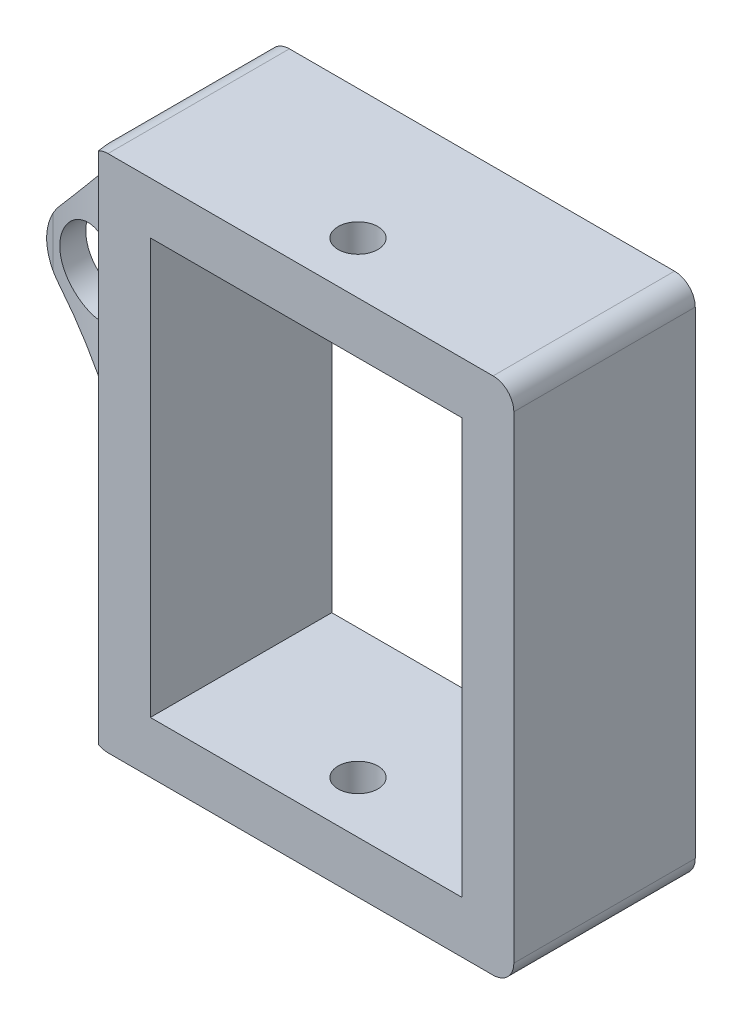
ISO-10303-21;
HEADER;
FILE_DESCRIPTION(('STEP AP214'),'2;1');
FILE_NAME('part.step','',(''),(''),'','','');
FILE_SCHEMA(('AUTOMOTIVE_DESIGN { 1 0 10303 214 1 1 1 1 }'));
ENDSEC;
DATA;
#1=APPLICATION_CONTEXT('core data for automotive mechanical design processes');
#2=APPLICATION_PROTOCOL_DEFINITION('international standard','automotive_design',2000,#1);
#3=PRODUCT_CONTEXT('',#1,'mechanical');
#4=PRODUCT('Part','Part','',(#3));
#5=PRODUCT_RELATED_PRODUCT_CATEGORY('part','',(#4));
#6=PRODUCT_DEFINITION_FORMATION('','',#4);
#7=PRODUCT_DEFINITION_CONTEXT('part definition',#1,'design');
#8=PRODUCT_DEFINITION('design','',#6,#7);
#9=PRODUCT_DEFINITION_SHAPE('','',#8);
#10=(LENGTH_UNIT() NAMED_UNIT(*) SI_UNIT(.MILLI.,.METRE.));
#11=(NAMED_UNIT(*) PLANE_ANGLE_UNIT() SI_UNIT($,.RADIAN.));
#12=(NAMED_UNIT(*) SI_UNIT($,.STERADIAN.) SOLID_ANGLE_UNIT());
#13=UNCERTAINTY_MEASURE_WITH_UNIT(LENGTH_MEASURE(1.E-05),#10,'distance_accuracy_value','');
#14=(GEOMETRIC_REPRESENTATION_CONTEXT(3) GLOBAL_UNCERTAINTY_ASSIGNED_CONTEXT((#13)) GLOBAL_UNIT_ASSIGNED_CONTEXT((#10,
#11,#12)) REPRESENTATION_CONTEXT('',''));
#15=CARTESIAN_POINT('',(0.,0.,0.));
#16=DIRECTION('',(0.,0.,1.));
#17=DIRECTION('',(1.,0.,0.));
#18=AXIS2_PLACEMENT_3D('',#15,#16,#17);
#19=CARTESIAN_POINT('',(0.,0.,22.225));
#20=DIRECTION('',(0.,0.,1.));
#21=DIRECTION('',(1.,0.,0.));
#22=AXIS2_PLACEMENT_3D('',#19,#20,#21);
#23=PLANE('',#22);
#24=DIRECTION('',(0.,1.,0.));
#25=VECTOR('',#24,1.);
#26=CARTESIAN_POINT('',(25.4381,31.7881,22.225));
#27=LINE('',#26,#25);
#28=CARTESIAN_POINT('',(25.4381,-29.2481,22.225));
#29=VERTEX_POINT('',#28);
#30=CARTESIAN_POINT('',(25.4381,29.2481,22.225));
#31=VERTEX_POINT('',#30);
#32=EDGE_CURVE('E240',#29,#31,#27,.T.);
#33=ORIENTED_EDGE('',*,*,#32,.T.);
#34=CARTESIAN_POINT('',(22.8981,29.2481,22.225));
#35=DIRECTION('',(0.,0.,1.));
#36=DIRECTION('',(1.,0.,0.));
#37=AXIS2_PLACEMENT_3D('',#34,#35,#36);
#38=CIRCLE('',#37,2.54);
#39=CARTESIAN_POINT('',(22.8981,31.7881,22.225));
#40=VERTEX_POINT('',#39);
#41=EDGE_CURVE('E381',#31,#40,#38,.T.);
#42=ORIENTED_EDGE('',*,*,#41,.T.);
#43=DIRECTION('',(-1.,0.,0.));
#44=VECTOR('',#43,1.);
#45=CARTESIAN_POINT('',(-25.4381,31.7881,22.225));
#46=LINE('',#45,#44);
#47=CARTESIAN_POINT('',(-24.2751869518396,31.7881,22.225));
#48=VERTEX_POINT('',#47);
#49=EDGE_CURVE('E243',#40,#48,#46,.T.);
#50=ORIENTED_EDGE('',*,*,#49,.T.);
#51=CARTESIAN_POINT('',(-24.2751869518396,29.2481,22.225));
#52=DIRECTION('',(0.,0.,1.));
#53=DIRECTION('',(1.,0.,0.));
#54=AXIS2_PLACEMENT_3D('',#51,#52,#53);
#55=CIRCLE('',#54,2.54);
#56=CARTESIAN_POINT('',(-25.4381,31.506248188764,22.225));
#57=VERTEX_POINT('',#56);
#58=EDGE_CURVE('E382',#48,#57,#55,.T.);
#59=ORIENTED_EDGE('',*,*,#58,.T.);
#60=DIRECTION('',(0.,-1.,0.));
#61=VECTOR('',#60,1.);
#62=CARTESIAN_POINT('',(-25.4381,31.7881,22.225));
#63=LINE('',#62,#61);
#64=CARTESIAN_POINT('',(-25.4381,-31.506248188764,22.225));
#65=VERTEX_POINT('',#64);
#66=EDGE_CURVE('E233',#57,#65,#63,.T.);
#67=ORIENTED_EDGE('',*,*,#66,.T.);
#68=CARTESIAN_POINT('',(-24.2751869518396,-29.2481,22.225));
#69=DIRECTION('',(0.,0.,1.));
#70=DIRECTION('',(1.,0.,0.));
#71=AXIS2_PLACEMENT_3D('',#68,#69,#70);
#72=CIRCLE('',#71,2.54);
#73=CARTESIAN_POINT('',(-24.2751869518396,-31.7881,22.225));
#74=VERTEX_POINT('',#73);
#75=EDGE_CURVE('E380',#65,#74,#72,.T.);
#76=ORIENTED_EDGE('',*,*,#75,.T.);
#77=DIRECTION('',(1.,0.,0.));
#78=VECTOR('',#77,1.);
#79=CARTESIAN_POINT('',(-25.4381,-31.7881,22.225));
#80=LINE('',#79,#78);
#81=CARTESIAN_POINT('',(22.8981,-31.7881,22.225));
#82=VERTEX_POINT('',#81);
#83=EDGE_CURVE('E236',#74,#82,#80,.T.);
#84=ORIENTED_EDGE('',*,*,#83,.T.);
#85=CARTESIAN_POINT('',(22.8981,-29.2481,22.225));
#86=DIRECTION('',(0.,0.,1.));
#87=DIRECTION('',(1.,0.,0.));
#88=AXIS2_PLACEMENT_3D('',#85,#86,#87);
#89=CIRCLE('',#88,2.54);
#90=EDGE_CURVE('E351',#82,#29,#89,.T.);
#91=ORIENTED_EDGE('',*,*,#90,.T.);
#92=EDGE_LOOP('',(#33,#42,#50,#59,#67,#76,#84,#91));
#93=FACE_BOUND('',#92,.T.);
#94=DIRECTION('',(1.,0.,0.));
#95=VECTOR('',#94,1.);
#96=CARTESIAN_POINT('',(-19.0881,-25.4381,22.225));
#97=LINE('',#96,#95);
#98=CARTESIAN_POINT('',(-19.0881,-25.4381,22.225));
#99=VERTEX_POINT('',#98);
#100=CARTESIAN_POINT('',(19.0881,-25.4381,22.225));
#101=VERTEX_POINT('',#100);
#102=EDGE_CURVE('E204',#99,#101,#97,.T.);
#103=ORIENTED_EDGE('',*,*,#102,.F.);
#104=DIRECTION('',(0.,-1.,0.));
#105=VECTOR('',#104,1.);
#106=CARTESIAN_POINT('',(-19.0881,25.4381,22.225));
#107=LINE('',#106,#105);
#108=CARTESIAN_POINT('',(-19.0881,25.4381,22.225));
#109=VERTEX_POINT('',#108);
#110=EDGE_CURVE('E202',#109,#99,#107,.T.);
#111=ORIENTED_EDGE('',*,*,#110,.F.);
#112=DIRECTION('',(-1.,0.,0.));
#113=VECTOR('',#112,1.);
#114=CARTESIAN_POINT('',(-19.0881,25.4381,22.225));
#115=LINE('',#114,#113);
#116=CARTESIAN_POINT('',(19.0881,25.4381,22.225));
#117=VERTEX_POINT('',#116);
#118=EDGE_CURVE('E210',#117,#109,#115,.T.);
#119=ORIENTED_EDGE('',*,*,#118,.F.);
#120=DIRECTION('',(0.,1.,0.));
#121=VECTOR('',#120,1.);
#122=CARTESIAN_POINT('',(19.0881,25.4381,22.225));
#123=LINE('',#122,#121);
#124=EDGE_CURVE('E207',#101,#117,#123,.T.);
#125=ORIENTED_EDGE('',*,*,#124,.F.);
#126=EDGE_LOOP('',(#103,#111,#119,#125));
#127=FACE_BOUND('',#126,.T.);
#128=ADVANCED_FACE('F51',(#93,#127),#23,.T.);
#129=CARTESIAN_POINT('',(0.,0.,0.));
#130=DIRECTION('',(0.,0.,1.));
#131=DIRECTION('',(1.,0.,0.));
#132=AXIS2_PLACEMENT_3D('',#129,#130,#131);
#133=PLANE('',#132);
#134=DIRECTION('',(-1.,0.,0.));
#135=VECTOR('',#134,1.);
#136=CARTESIAN_POINT('',(-25.4381,31.7881,0.));
#137=LINE('',#136,#135);
#138=CARTESIAN_POINT('',(22.8981,31.7881,0.));
#139=VERTEX_POINT('',#138);
#140=CARTESIAN_POINT('',(-24.2751869518396,31.7881,0.));
#141=VERTEX_POINT('',#140);
#142=EDGE_CURVE('E237',#139,#141,#137,.T.);
#143=ORIENTED_EDGE('',*,*,#142,.F.);
#144=CARTESIAN_POINT('',(22.8981,29.2481,0.));
#145=DIRECTION('',(0.,0.,1.));
#146=DIRECTION('',(1.,0.,0.));
#147=AXIS2_PLACEMENT_3D('',#144,#145,#146);
#148=CIRCLE('',#147,2.54);
#149=CARTESIAN_POINT('',(25.4381,29.2481,0.));
#150=VERTEX_POINT('',#149);
#151=EDGE_CURVE('E392',#139,#150,#148,.F.);
#152=ORIENTED_EDGE('',*,*,#151,.T.);
#153=DIRECTION('',(0.,1.,0.));
#154=VECTOR('',#153,1.);
#155=CARTESIAN_POINT('',(25.4381,31.7881,0.));
#156=LINE('',#155,#154);
#157=CARTESIAN_POINT('',(25.4381,-29.2481,0.));
#158=VERTEX_POINT('',#157);
#159=EDGE_CURVE('E249',#158,#150,#156,.T.);
#160=ORIENTED_EDGE('',*,*,#159,.F.);
#161=CARTESIAN_POINT('',(22.8981,-29.2481,0.));
#162=DIRECTION('',(0.,0.,1.));
#163=DIRECTION('',(1.,0.,0.));
#164=AXIS2_PLACEMENT_3D('',#161,#162,#163);
#165=CIRCLE('',#164,2.54);
#166=CARTESIAN_POINT('',(22.8981,-31.7881,0.));
#167=VERTEX_POINT('',#166);
#168=EDGE_CURVE('E349',#158,#167,#165,.F.);
#169=ORIENTED_EDGE('',*,*,#168,.T.);
#170=DIRECTION('',(1.,0.,0.));
#171=VECTOR('',#170,1.);
#172=CARTESIAN_POINT('',(-25.4381,-31.7881,0.));
#173=LINE('',#172,#171);
#174=CARTESIAN_POINT('',(-24.2751869518396,-31.7881,0.));
#175=VERTEX_POINT('',#174);
#176=EDGE_CURVE('E232',#175,#167,#173,.T.);
#177=ORIENTED_EDGE('',*,*,#176,.F.);
#178=CARTESIAN_POINT('',(-24.2751869518396,-29.2481,0.));
#179=DIRECTION('',(0.,0.,1.));
#180=DIRECTION('',(1.,0.,0.));
#181=AXIS2_PLACEMENT_3D('',#178,#179,#180);
#182=CIRCLE('',#181,2.54);
#183=CARTESIAN_POINT('',(-26.1979654706544,-30.9077755006881,0.));
#184=VERTEX_POINT('',#183);
#185=EDGE_CURVE('E397',#175,#184,#182,.F.);
#186=ORIENTED_EDGE('',*,*,#185,.T.);
#187=DIRECTION('',(-0.653415551451999,0.756999416856235,0.));
#188=VECTOR('',#187,1.);
#189=CARTESIAN_POINT('',(-30.3007682363136,-26.1545686108635,0.));
#190=LINE('',#189,#188);
#191=CARTESIAN_POINT('',(-49.2950462970371,-4.1491887517202,0.));
#192=VERTEX_POINT('',#191);
#193=EDGE_CURVE('E175',#184,#192,#190,.T.);
#194=ORIENTED_EDGE('',*,*,#193,.T.);
#195=CARTESIAN_POINT('',(-44.4881,0.,0.));
#196=DIRECTION('',(0.,0.,-1.));
#197=DIRECTION('',(-1.,0.,0.));
#198=AXIS2_PLACEMENT_3D('',#195,#196,#197);
#199=CIRCLE('',#198,6.35);
#200=CARTESIAN_POINT('',(-49.2950462970371,4.14918875172019,0.));
#201=VERTEX_POINT('',#200);
#202=EDGE_CURVE('E176',#192,#201,#199,.T.);
#203=ORIENTED_EDGE('',*,*,#202,.T.);
#204=DIRECTION('',(-0.653415551451999,-0.756999416856236,0.));
#205=VECTOR('',#204,1.);
#206=CARTESIAN_POINT('',(-30.3007682363136,26.1545686108635,0.));
#207=LINE('',#206,#205);
#208=CARTESIAN_POINT('',(-26.1979654706544,30.9077755006881,0.));
#209=VERTEX_POINT('',#208);
#210=EDGE_CURVE('E166',#209,#201,#207,.T.);
#211=ORIENTED_EDGE('',*,*,#210,.F.);
#212=CARTESIAN_POINT('',(-24.2751869518396,29.2481,0.));
#213=DIRECTION('',(0.,0.,1.));
#214=DIRECTION('',(1.,0.,0.));
#215=AXIS2_PLACEMENT_3D('',#212,#213,#214);
#216=CIRCLE('',#215,2.54);
#217=EDGE_CURVE('E394',#209,#141,#216,.F.);
#218=ORIENTED_EDGE('',*,*,#217,.T.);
#219=EDGE_LOOP('',(#143,#152,#160,#169,#177,#186,#194,#203,#211,#218));
#220=FACE_BOUND('',#219,.T.);
#221=DIRECTION('',(0.,-1.,0.));
#222=VECTOR('',#221,1.);
#223=CARTESIAN_POINT('',(-19.0881,25.4381,0.));
#224=LINE('',#223,#222);
#225=CARTESIAN_POINT('',(-19.0881,25.4381,0.));
#226=VERTEX_POINT('',#225);
#227=CARTESIAN_POINT('',(-19.0881,-25.4381,0.));
#228=VERTEX_POINT('',#227);
#229=EDGE_CURVE('E200',#226,#228,#224,.T.);
#230=ORIENTED_EDGE('',*,*,#229,.T.);
#231=DIRECTION('',(1.,0.,0.));
#232=VECTOR('',#231,1.);
#233=CARTESIAN_POINT('',(-19.0881,-25.4381,0.));
#234=LINE('',#233,#232);
#235=CARTESIAN_POINT('',(19.0881,-25.4381,0.));
#236=VERTEX_POINT('',#235);
#237=EDGE_CURVE('E215',#228,#236,#234,.T.);
#238=ORIENTED_EDGE('',*,*,#237,.T.);
#239=DIRECTION('',(0.,1.,0.));
#240=VECTOR('',#239,1.);
#241=CARTESIAN_POINT('',(19.0881,25.4381,0.));
#242=LINE('',#241,#240);
#243=CARTESIAN_POINT('',(19.0881,25.4381,0.));
#244=VERTEX_POINT('',#243);
#245=EDGE_CURVE('E218',#236,#244,#242,.T.);
#246=ORIENTED_EDGE('',*,*,#245,.T.);
#247=DIRECTION('',(-1.,0.,0.));
#248=VECTOR('',#247,1.);
#249=CARTESIAN_POINT('',(-19.0881,25.4381,0.));
#250=LINE('',#249,#248);
#251=EDGE_CURVE('E205',#244,#226,#250,.T.);
#252=ORIENTED_EDGE('',*,*,#251,.T.);
#253=EDGE_LOOP('',(#230,#238,#246,#252));
#254=FACE_BOUND('',#253,.T.);
#255=CARTESIAN_POINT('',(-44.4881,0.,0.));
#256=DIRECTION('',(0.,0.,-1.));
#257=DIRECTION('',(-1.,0.,0.));
#258=AXIS2_PLACEMENT_3D('',#255,#256,#257);
#259=CIRCLE('',#258,4.73075);
#260=CARTESIAN_POINT('',(-49.21885,0.,0.));
#261=VERTEX_POINT('',#260);
#262=EDGE_CURVE('E194',#261,#261,#259,.T.);
#263=ORIENTED_EDGE('',*,*,#262,.F.);
#264=EDGE_LOOP('',(#263));
#265=FACE_BOUND('',#264,.T.);
#266=ADVANCED_FACE('F188',(#220,#254,#265),#133,.F.);
#267=CARTESIAN_POINT('',(-25.4381,-31.7881,22.225));
#268=DIRECTION('',(0.,1.,0.));
#269=DIRECTION('',(-1.,0.,0.));
#270=AXIS2_PLACEMENT_3D('',#267,#268,#269);
#271=PLANE('',#270);
#272=CARTESIAN_POINT('',(0.,-31.7881,15.875));
#273=DIRECTION('',(0.,-1.,0.));
#274=DIRECTION('',(0.,0.,-1.));
#275=AXIS2_PLACEMENT_3D('',#272,#273,#274);
#276=CIRCLE('',#275,2.4384);
#277=CARTESIAN_POINT('',(0.,-31.7881,13.4366));
#278=VERTEX_POINT('',#277);
#279=EDGE_CURVE('E338',#278,#278,#276,.T.);
#280=ORIENTED_EDGE('',*,*,#279,.F.);
#281=EDGE_LOOP('',(#280));
#282=FACE_BOUND('',#281,.T.);
#283=ORIENTED_EDGE('',*,*,#176,.T.);
#284=DIRECTION('',(0.,0.,-1.));
#285=VECTOR('',#284,1.);
#286=CARTESIAN_POINT('',(22.8981,-31.7881,22.225));
#287=LINE('',#286,#285);
#288=EDGE_CURVE('E60',#167,#82,#287,.F.);
#289=ORIENTED_EDGE('',*,*,#288,.T.);
#290=ORIENTED_EDGE('',*,*,#83,.F.);
#291=DIRECTION('',(0.,0.,-1.));
#292=VECTOR('',#291,1.);
#293=CARTESIAN_POINT('',(-24.2751869518396,-31.7881,0.));
#294=LINE('',#293,#292);
#295=EDGE_CURVE('E344',#74,#175,#294,.T.);
#296=ORIENTED_EDGE('',*,*,#295,.T.);
#297=EDGE_LOOP('',(#283,#289,#290,#296));
#298=FACE_BOUND('',#297,.T.);
#299=ADVANCED_FACE('F317',(#282,#298),#271,.F.);
#300=CARTESIAN_POINT('',(25.4381,31.7881,22.225));
#301=DIRECTION('',(-1.,0.,0.));
#302=DIRECTION('',(0.,-1.,0.));
#303=AXIS2_PLACEMENT_3D('',#300,#301,#302);
#304=PLANE('',#303);
#305=ORIENTED_EDGE('',*,*,#159,.T.);
#306=DIRECTION('',(0.,0.,-1.));
#307=VECTOR('',#306,1.);
#308=CARTESIAN_POINT('',(25.4381,29.2481,22.225));
#309=LINE('',#308,#307);
#310=EDGE_CURVE('E388',#150,#31,#309,.F.);
#311=ORIENTED_EDGE('',*,*,#310,.T.);
#312=ORIENTED_EDGE('',*,*,#32,.F.);
#313=DIRECTION('',(0.,0.,-1.));
#314=VECTOR('',#313,1.);
#315=CARTESIAN_POINT('',(25.4381,-29.2481,22.225));
#316=LINE('',#315,#314);
#317=EDGE_CURVE('E390',#29,#158,#316,.T.);
#318=ORIENTED_EDGE('',*,*,#317,.T.);
#319=EDGE_LOOP('',(#305,#311,#312,#318));
#320=FACE_BOUND('',#319,.T.);
#321=ADVANCED_FACE('F327',(#320),#304,.F.);
#322=CARTESIAN_POINT('',(-25.4381,31.7881,22.225));
#323=DIRECTION('',(0.,-1.,0.));
#324=DIRECTION('',(0.,0.,-1.));
#325=AXIS2_PLACEMENT_3D('',#322,#323,#324);
#326=PLANE('',#325);
#327=CARTESIAN_POINT('',(0.,31.7881,15.875));
#328=DIRECTION('',(0.,-1.,0.));
#329=DIRECTION('',(0.,0.,-1.));
#330=AXIS2_PLACEMENT_3D('',#327,#328,#329);
#331=CIRCLE('',#330,2.4384);
#332=CARTESIAN_POINT('',(0.,31.7881,13.4366));
#333=VERTEX_POINT('',#332);
#334=EDGE_CURVE('E258',#333,#333,#331,.T.);
#335=ORIENTED_EDGE('',*,*,#334,.T.);
#336=EDGE_LOOP('',(#335));
#337=FACE_BOUND('',#336,.T.);
#338=ORIENTED_EDGE('',*,*,#49,.F.);
#339=DIRECTION('',(0.,0.,-1.));
#340=VECTOR('',#339,1.);
#341=CARTESIAN_POINT('',(22.8981,31.7881,22.225));
#342=LINE('',#341,#340);
#343=EDGE_CURVE('E398',#40,#139,#342,.T.);
#344=ORIENTED_EDGE('',*,*,#343,.T.);
#345=ORIENTED_EDGE('',*,*,#142,.T.);
#346=DIRECTION('',(0.,0.,-1.));
#347=VECTOR('',#346,1.);
#348=CARTESIAN_POINT('',(-24.2751869518396,31.7881,22.225));
#349=LINE('',#348,#347);
#350=EDGE_CURVE('E289',#141,#48,#349,.F.);
#351=ORIENTED_EDGE('',*,*,#350,.T.);
#352=EDGE_LOOP('',(#338,#344,#345,#351));
#353=FACE_BOUND('',#352,.T.);
#354=ADVANCED_FACE('F324',(#337,#353),#326,.F.);
#355=CARTESIAN_POINT('',(-19.0881,25.4381,22.225));
#356=DIRECTION('',(1.,0.,0.));
#357=DIRECTION('',(0.,1.,0.));
#358=AXIS2_PLACEMENT_3D('',#355,#356,#357);
#359=PLANE('',#358);
#360=ORIENTED_EDGE('',*,*,#229,.F.);
#361=DIRECTION('',(0.,0.,-1.));
#362=VECTOR('',#361,1.);
#363=CARTESIAN_POINT('',(-19.0881,25.4381,22.225));
#364=LINE('',#363,#362);
#365=EDGE_CURVE('E212',#109,#226,#364,.T.);
#366=ORIENTED_EDGE('',*,*,#365,.F.);
#367=ORIENTED_EDGE('',*,*,#110,.T.);
#368=DIRECTION('',(0.,0.,-1.));
#369=VECTOR('',#368,1.);
#370=CARTESIAN_POINT('',(-19.0881,-25.4381,22.225));
#371=LINE('',#370,#369);
#372=EDGE_CURVE('E229',#99,#228,#371,.T.);
#373=ORIENTED_EDGE('',*,*,#372,.T.);
#374=EDGE_LOOP('',(#360,#366,#367,#373));
#375=FACE_BOUND('',#374,.T.);
#376=ADVANCED_FACE('F321',(#375),#359,.T.);
#377=CARTESIAN_POINT('',(-19.0881,-25.4381,22.225));
#378=DIRECTION('',(0.,1.,0.));
#379=DIRECTION('',(0.,0.,1.));
#380=AXIS2_PLACEMENT_3D('',#377,#378,#379);
#381=PLANE('',#380);
#382=CARTESIAN_POINT('',(0.,-25.4381,15.875));
#383=DIRECTION('',(0.,1.,0.));
#384=DIRECTION('',(0.,0.,1.));
#385=AXIS2_PLACEMENT_3D('',#382,#383,#384);
#386=CIRCLE('',#385,2.4384);
#387=CARTESIAN_POINT('',(0.,-25.4381,18.3134));
#388=VERTEX_POINT('',#387);
#389=EDGE_CURVE('E257',#388,#388,#386,.T.);
#390=ORIENTED_EDGE('',*,*,#389,.F.);
#391=EDGE_LOOP('',(#390));
#392=FACE_BOUND('',#391,.T.);
#393=ORIENTED_EDGE('',*,*,#237,.F.);
#394=ORIENTED_EDGE('',*,*,#372,.F.);
#395=ORIENTED_EDGE('',*,*,#102,.T.);
#396=DIRECTION('',(0.,0.,-1.));
#397=VECTOR('',#396,1.);
#398=CARTESIAN_POINT('',(19.0881,-25.4381,22.225));
#399=LINE('',#398,#397);
#400=EDGE_CURVE('E227',#101,#236,#399,.T.);
#401=ORIENTED_EDGE('',*,*,#400,.T.);
#402=EDGE_LOOP('',(#393,#394,#395,#401));
#403=FACE_BOUND('',#402,.T.);
#404=ADVANCED_FACE('F453',(#392,#403),#381,.T.);
#405=CARTESIAN_POINT('',(19.0881,25.4381,22.225));
#406=DIRECTION('',(-1.,0.,0.));
#407=DIRECTION('',(0.,0.,1.));
#408=AXIS2_PLACEMENT_3D('',#405,#406,#407);
#409=PLANE('',#408);
#410=ORIENTED_EDGE('',*,*,#245,.F.);
#411=ORIENTED_EDGE('',*,*,#400,.F.);
#412=ORIENTED_EDGE('',*,*,#124,.T.);
#413=DIRECTION('',(0.,0.,-1.));
#414=VECTOR('',#413,1.);
#415=CARTESIAN_POINT('',(19.0881,25.4381,22.225));
#416=LINE('',#415,#414);
#417=EDGE_CURVE('E225',#117,#244,#416,.T.);
#418=ORIENTED_EDGE('',*,*,#417,.T.);
#419=EDGE_LOOP('',(#410,#411,#412,#418));
#420=FACE_BOUND('',#419,.T.);
#421=ADVANCED_FACE('F440',(#420),#409,.T.);
#422=CARTESIAN_POINT('',(-19.0881,25.4381,22.225));
#423=DIRECTION('',(0.,-1.,0.));
#424=DIRECTION('',(0.,0.,-1.));
#425=AXIS2_PLACEMENT_3D('',#422,#423,#424);
#426=PLANE('',#425);
#427=CARTESIAN_POINT('',(0.,25.4381,15.875));
#428=DIRECTION('',(0.,-1.,0.));
#429=DIRECTION('',(0.,0.,-1.));
#430=AXIS2_PLACEMENT_3D('',#427,#428,#429);
#431=CIRCLE('',#430,2.4384);
#432=CARTESIAN_POINT('',(0.,25.4381,13.4366));
#433=VERTEX_POINT('',#432);
#434=EDGE_CURVE('E254',#433,#433,#431,.T.);
#435=ORIENTED_EDGE('',*,*,#434,.F.);
#436=EDGE_LOOP('',(#435));
#437=FACE_BOUND('',#436,.T.);
#438=ORIENTED_EDGE('',*,*,#251,.F.);
#439=ORIENTED_EDGE('',*,*,#417,.F.);
#440=ORIENTED_EDGE('',*,*,#118,.T.);
#441=ORIENTED_EDGE('',*,*,#365,.T.);
#442=EDGE_LOOP('',(#438,#439,#440,#441));
#443=FACE_BOUND('',#442,.T.);
#444=ADVANCED_FACE('F279',(#437,#443),#426,.T.);
#445=CARTESIAN_POINT('',(-44.4881,0.,3.175));
#446=DIRECTION('',(0.,0.,-1.));
#447=DIRECTION('',(-1.,0.,0.));
#448=AXIS2_PLACEMENT_3D('',#445,#446,#447);
#449=CYLINDRICAL_SURFACE('',#448,6.35);
#450=ORIENTED_EDGE('',*,*,#202,.F.);
#451=DIRECTION('',(0.,0.,-1.));
#452=VECTOR('',#451,1.);
#453=CARTESIAN_POINT('',(-49.2950462970371,-4.1491887517202,3.175));
#454=LINE('',#453,#452);
#455=CARTESIAN_POINT('',(-49.2950462970371,-4.1491887517202,3.18567998611201));
#456=VERTEX_POINT('',#455);
#457=EDGE_CURVE('E184',#456,#192,#454,.T.);
#458=ORIENTED_EDGE('',*,*,#457,.F.);
#459=CARTESIAN_POINT('',(-49.2950462970371,-4.1491887517202,3.18567998611201));
#460=CARTESIAN_POINT('',(-49.365174159664,-4.06794753709652,3.18364589855929));
#461=CARTESIAN_POINT('',(-49.4332424485334,-3.98492085433734,3.18196196725733));
#462=CARTESIAN_POINT('',(-49.5649197186152,-3.81573773565724,3.17920134661327));
#463=CARTESIAN_POINT('',(-49.6285397515971,-3.72958992702452,3.17812310181834));
#464=CARTESIAN_POINT('',(-49.7513438075508,-3.55418439684874,3.17647128888356));
#465=CARTESIAN_POINT('',(-49.810527839189,-3.46492668138183,3.17589771975773));
#466=CARTESIAN_POINT('',(-49.9244573314012,-3.2832984014556,3.17516185637622));
#467=CARTESIAN_POINT('',(-49.9791909150988,-3.19092038242516,3.17500062977012));
#468=CARTESIAN_POINT('',(-50.0315442484171,-3.09721259597911,3.175));
#469=B_SPLINE_CURVE_WITH_KNOTS('',3,(#459,#460,#461,#462,#463,#464,#465,#466,#467,#468),
.UNSPECIFIED.,.F.,.F.,(4,2,2,2,4),(0.,0.321988102245008,0.643145487291413,0.964302244895094,
1.28628971318466),.UNSPECIFIED.);
#470=CARTESIAN_POINT('',(-50.0315442484171,-3.09721259597909,3.175));
#471=VERTEX_POINT('',#470);
#472=EDGE_CURVE('E284',#456,#471,#469,.T.);
#473=ORIENTED_EDGE('',*,*,#472,.T.);
#474=CARTESIAN_POINT('',(-44.4881,0.,3.175));
#475=DIRECTION('',(0.,0.,-1.));
#476=DIRECTION('',(-1.,0.,0.));
#477=AXIS2_PLACEMENT_3D('',#474,#475,#476);
#478=CIRCLE('',#477,6.35);
#479=CARTESIAN_POINT('',(-50.0315442484171,3.09721259597909,3.175));
#480=VERTEX_POINT('',#479);
#481=EDGE_CURVE('E185',#471,#480,#478,.T.);
#482=ORIENTED_EDGE('',*,*,#481,.T.);
#483=CARTESIAN_POINT('',(-50.0315442484171,3.0972125959791,3.175));
#484=CARTESIAN_POINT('',(-49.9791909150988,3.19092038242516,3.17500062977011));
#485=CARTESIAN_POINT('',(-49.9244573314012,3.28329840145559,3.17516185637622));
#486=CARTESIAN_POINT('',(-49.810527839189,3.46492668138182,3.17589771975773));
#487=CARTESIAN_POINT('',(-49.7513438075508,3.55418439684873,3.17647128888356));
#488=CARTESIAN_POINT('',(-49.6285397515971,3.72958992702451,3.17812310181834));
#489=CARTESIAN_POINT('',(-49.5649197186152,3.81573773565724,3.17920134661327));
#490=CARTESIAN_POINT('',(-49.4332424485334,3.98492085433735,3.18196196725732));
#491=CARTESIAN_POINT('',(-49.365174159664,4.06794753709653,3.18364589855928));
#492=CARTESIAN_POINT('',(-49.2950462970371,4.1491887517202,3.18567998611202));
#493=B_SPLINE_CURVE_WITH_KNOTS('',3,(#483,#484,#485,#486,#487,#488,#489,#490,#491,#492),
.UNSPECIFIED.,.F.,.F.,(4,2,2,2,4),(0.,0.321987468289564,0.643144225893256,0.964301610939658,
1.28628971318467),.UNSPECIFIED.);
#494=CARTESIAN_POINT('',(-49.2950462970371,4.14918875172019,3.18567998611201));
#495=VERTEX_POINT('',#494);
#496=EDGE_CURVE('E183',#480,#495,#493,.T.);
#497=ORIENTED_EDGE('',*,*,#496,.T.);
#498=DIRECTION('',(0.,0.,-1.));
#499=VECTOR('',#498,1.);
#500=CARTESIAN_POINT('',(-49.2950462970371,4.14918875172019,3.175));
#501=LINE('',#500,#499);
#502=EDGE_CURVE('E169',#495,#201,#501,.T.);
#503=ORIENTED_EDGE('',*,*,#502,.T.);
#504=EDGE_LOOP('',(#450,#458,#473,#482,#497,#503));
#505=FACE_BOUND('',#504,.T.);
#506=ADVANCED_FACE('F180',(#505),#449,.T.);
#507=CARTESIAN_POINT('',(-30.3007682363136,-26.1545686108635,3.175));
#508=DIRECTION('',(-0.756999416856235,-0.653415551451999,0.));
#509=DIRECTION('',(0.653415551451999,-0.756999416856235,0.));
#510=AXIS2_PLACEMENT_3D('',#507,#508,#509);
#511=PLANE('',#510);
#512=ORIENTED_EDGE('',*,*,#193,.F.);
#513=DIRECTION('',(0.,0.,-1.));
#514=VECTOR('',#513,1.);
#515=CARTESIAN_POINT('',(-26.1979654706544,-30.9077755006881,22.225));
#516=LINE('',#515,#514);
#517=CARTESIAN_POINT('',(-26.1979654706544,-30.9077755006881,19.7931708827726));
#518=VERTEX_POINT('',#517);
#519=EDGE_CURVE('E12',#184,#518,#516,.F.);
#520=ORIENTED_EDGE('',*,*,#519,.T.);
#521=CARTESIAN_POINT('',(-50.0315442484171,-3.2959361493425,28.575));
#522=DIRECTION('',(-0.756999416856235,-0.653415551451999,0.));
#523=DIRECTION('',(0.653415551451999,-0.756999416856235,0.));
#524=AXIS2_PLACEMENT_3D('',#521,#522,#523);
#525=ELLIPSE('',#524,38.8726591271924,25.4);
#526=EDGE_CURVE('E290',#518,#456,#525,.F.);
#527=ORIENTED_EDGE('',*,*,#526,.T.);
#528=ORIENTED_EDGE('',*,*,#457,.T.);
#529=EDGE_LOOP('',(#512,#520,#527,#528));
#530=FACE_BOUND('',#529,.T.);
#531=ADVANCED_FACE('F278',(#530),#511,.T.);
#532=CARTESIAN_POINT('',(-30.3007682363136,26.1545686108635,3.175));
#533=DIRECTION('',(0.756999416856235,-0.653415551451999,0.));
#534=DIRECTION('',(0.653415551451999,0.756999416856236,0.));
#535=AXIS2_PLACEMENT_3D('',#532,#533,#534);
#536=PLANE('',#535);
#537=CARTESIAN_POINT('',(-50.0315442484171,3.2959361493425,28.575));
#538=DIRECTION('',(0.756999416856235,-0.653415551451999,0.));
#539=DIRECTION('',(-0.653415551451999,-0.756999416856236,0.));
#540=AXIS2_PLACEMENT_3D('',#537,#538,#539);
#541=ELLIPSE('',#540,38.8726591271924,25.4);
#542=CARTESIAN_POINT('',(-26.1979654706544,30.9077755006881,19.7931708827726));
#543=VERTEX_POINT('',#542);
#544=EDGE_CURVE('E268',#495,#543,#541,.T.);
#545=ORIENTED_EDGE('',*,*,#544,.T.);
#546=DIRECTION('',(0.,0.,-1.));
#547=VECTOR('',#546,1.);
#548=CARTESIAN_POINT('',(-26.1979654706544,30.9077755006881,3.175));
#549=LINE('',#548,#547);
#550=EDGE_CURVE('E172',#543,#209,#549,.T.);
#551=ORIENTED_EDGE('',*,*,#550,.T.);
#552=ORIENTED_EDGE('',*,*,#210,.T.);
#553=ORIENTED_EDGE('',*,*,#502,.F.);
#554=EDGE_LOOP('',(#545,#551,#552,#553));
#555=FACE_BOUND('',#554,.T.);
#556=ADVANCED_FACE('F168',(#555),#536,.F.);
#557=CARTESIAN_POINT('',(0.,0.,3.175));
#558=DIRECTION('',(0.,0.,-1.));
#559=DIRECTION('',(-1.,0.,0.));
#560=AXIS2_PLACEMENT_3D('',#557,#558,#559);
#561=PLANE('',#560);
#562=ORIENTED_EDGE('',*,*,#481,.F.);
#563=DIRECTION('',(0.,-1.,0.));
#564=VECTOR('',#563,1.);
#565=CARTESIAN_POINT('',(-50.0315442484171,0.,3.175));
#566=LINE('',#565,#564);
#567=EDGE_CURVE('E246',#471,#480,#566,.F.);
#568=ORIENTED_EDGE('',*,*,#567,.T.);
#569=EDGE_LOOP('',(#562,#568));
#570=FACE_BOUND('',#569,.T.);
#571=ADVANCED_FACE('F303',(#570),#561,.F.);
#572=CARTESIAN_POINT('',(-44.4881,0.,3.175));
#573=DIRECTION('',(0.,0.,-1.));
#574=DIRECTION('',(-1.,0.,0.));
#575=AXIS2_PLACEMENT_3D('',#572,#573,#574);
#576=CYLINDRICAL_SURFACE('',#575,4.73075);
#577=CARTESIAN_POINT('',(-39.75735,0.,5.34568807420691));
#578=CARTESIAN_POINT('',(-39.7573472024911,-0.125672813540549,5.34569007055058));
#579=CARTESIAN_POINT('',(-39.7623603934547,-0.251315330332605,5.34347026986992));
#580=CARTESIAN_POINT('',(-39.782351517228,-0.501688433125518,5.33464336562544));
#581=CARTESIAN_POINT('',(-39.797331356176,-0.626418840069637,5.32803542282255));
#582=CARTESIAN_POINT('',(-39.8371072290411,-0.874073055776818,5.31056529932418));
#583=CARTESIAN_POINT('',(-39.8619091903401,-0.996995727078862,5.29970054980476));
#584=CARTESIAN_POINT('',(-39.921073780702,-1.24013254641868,5.27393935340643));
#585=CARTESIAN_POINT('',(-39.955440109038,-1.36034562696374,5.25904134661902));
#586=CARTESIAN_POINT('',(-40.0332671461395,-1.59684165058688,5.22556228950596));
#587=CARTESIAN_POINT('',(-40.0766991259787,-1.71313569229721,5.20699288338111));
#588=CARTESIAN_POINT('',(-40.1723147429038,-1.94147844590167,5.16649114291657));
#589=CARTESIAN_POINT('',(-40.224501637133,-2.05352555869526,5.14455755724228));
#590=CARTESIAN_POINT('',(-40.3935090673801,-2.38220436314227,5.0742941427387));
#591=CARTESIAN_POINT('',(-40.5228523636344,-2.59160227714608,5.0214682353266));
#592=CARTESIAN_POINT('',(-40.8173751846023,-2.99517103434256,4.90465517929252));
#593=CARTESIAN_POINT('',(-40.9839056246292,-3.1882323395629,4.84027269294112));
#594=CARTESIAN_POINT('',(-41.344564708459,-3.54435056219503,4.7059110884207));
#595=CARTESIAN_POINT('',(-41.5387024383838,-3.70739756058772,4.63593013101097));
#596=CARTESIAN_POINT('',(-41.9646518829112,-4.0106503229286,4.48891572842389));
#597=CARTESIAN_POINT('',(-42.1981613619468,-4.1484053155728,4.41173477886506));
#598=CARTESIAN_POINT('',(-42.6857277790951,-4.38230239769625,4.25907476884758));
#599=CARTESIAN_POINT('',(-42.9397884468181,-4.47843691373182,4.18359602049547));
#600=CARTESIAN_POINT('',(-43.4673510790453,-4.62760172386698,4.03629990651918));
#601=CARTESIAN_POINT('',(-43.7411434238414,-4.67971523114183,3.9645882794764));
#602=CARTESIAN_POINT('',(-44.2956489369066,-4.73503360028036,3.8294779204806));
#603=CARTESIAN_POINT('',(-44.5763607536642,-4.7382479384917,3.76607758021418));
#604=CARTESIAN_POINT('',(-45.1275621218583,-4.69522830416889,3.6513600489055));
#605=CARTESIAN_POINT('',(-45.3981036790884,-4.65048973791449,3.59973493335962));
#606=CARTESIAN_POINT('',(-45.9290417589139,-4.51428182610471,3.50705075248388));
#607=CARTESIAN_POINT('',(-46.189440519259,-4.42282285178933,3.46598934520738));
#608=CARTESIAN_POINT('',(-46.6821569199509,-4.19958773697243,3.39561700191355));
#609=CARTESIAN_POINT('',(-46.9151591596087,-4.06943975777714,3.36592543905226));
#610=CARTESIAN_POINT('',(-47.3565950255956,-3.77129286900511,3.3152678885465));
#611=CARTESIAN_POINT('',(-47.5650306100392,-3.60329697925299,3.29430120513755));
#612=CARTESIAN_POINT('',(-47.9481553719697,-3.23686459792646,3.25986505570923));
#613=CARTESIAN_POINT('',(-48.1232819592714,-3.03889454104464,3.24629329744934));
#614=CARTESIAN_POINT('',(-48.4382787389863,-2.61639372104469,3.22452652817034));
#615=CARTESIAN_POINT('',(-48.5781486113632,-2.39186271685154,3.21633156595705));
#616=CARTESIAN_POINT('',(-48.8189445373924,-1.9218991469715,3.20367267878781));
#617=CARTESIAN_POINT('',(-48.9197575987908,-1.67640840801156,3.19921953619671));
#618=CARTESIAN_POINT('',(-49.0789962202843,-1.17201305519249,3.19274147065676));
#619=CARTESIAN_POINT('',(-49.1374209124583,-0.913108166788843,3.19071659742728));
#620=CARTESIAN_POINT('',(-49.210379954977,-0.388076150287172,3.18825043503472));
#621=CARTESIAN_POINT('',(-49.2247305279259,-0.121923437338045,3.18781577520482));
#622=CARTESIAN_POINT('',(-49.2086126216442,0.409022198367032,3.18833337412741));
#623=CARTESIAN_POINT('',(-49.17814357114,0.673815103747626,3.18928565055786));
#624=CARTESIAN_POINT('',(-49.0732010246355,1.19478732580745,3.19303187349523));
#625=CARTESIAN_POINT('',(-48.9986851856133,1.45095810307871,3.19582759243786));
#626=CARTESIAN_POINT('',(-48.8077467987632,1.94712743912032,3.20432017650971));
#627=CARTESIAN_POINT('',(-48.6913242735719,2.18712600662627,3.21001704007183));
#628=CARTESIAN_POINT('',(-48.4201084207609,2.64381296735213,3.22580616255067));
#629=CARTESIAN_POINT('',(-48.2653620072105,2.86052939968138,3.23589305877236));
#630=CARTESIAN_POINT('',(-47.9219825259589,3.26477685980629,3.26217105706535));
#631=CARTESIAN_POINT('',(-47.7333510863215,3.45230928898963,3.27836186590479));
#632=CARTESIAN_POINT('',(-47.3287940961143,3.79208543727203,3.31839325686309));
#633=CARTESIAN_POINT('',(-47.1129969192702,3.94448616213475,3.34219862196997));
#634=CARTESIAN_POINT('',(-46.6599799504566,4.21093620048415,3.39872981572201));
#635=CARTESIAN_POINT('',(-46.4227612688093,4.32498750025782,3.43145518220169));
#636=CARTESIAN_POINT('',(-45.9345368945074,4.51176290260594,3.50638696985239));
#637=CARTESIAN_POINT('',(-45.6835582849624,4.58456520262816,3.54857523832848));
#638=CARTESIAN_POINT('',(-45.1747591659137,4.68784635834178,3.64231958557209));
#639=CARTESIAN_POINT('',(-44.9169381846369,4.71832228791588,3.69387631172361));
#640=CARTESIAN_POINT('',(-44.3974317359153,4.73713333463787,3.80629924873757));
#641=CARTESIAN_POINT('',(-44.135751448755,4.72477659813663,3.86730295067469));
#642=CARTESIAN_POINT('',(-43.6196412982183,4.65763310946454,3.99618139486254));
#643=CARTESIAN_POINT('',(-43.3652128650116,4.60283804705876,4.06405748059413));
#644=CARTESIAN_POINT('',(-42.860557612449,4.45007373122286,4.20681894245745));
#645=CARTESIAN_POINT('',(-42.6108425637421,4.35056851875079,4.28187141914592));
#646=CARTESIAN_POINT('',(-42.1320884625861,4.11107529851167,4.43329839491147));
#647=CARTESIAN_POINT('',(-41.9030545727387,3.97107721903876,4.50967321844444));
#648=CARTESIAN_POINT('',(-41.4646679002069,3.64896348846949,4.66215675378188));
#649=CARTESIAN_POINT('',(-41.2561231012766,3.46569883093376,4.73818708320637));
#650=CARTESIAN_POINT('',(-40.9689460186017,3.16462977208803,4.84653852720397));
#651=CARTESIAN_POINT('',(-40.877440462169,3.05983162290333,4.88172854479171));
#652=CARTESIAN_POINT('',(-40.7036781770256,2.84209636256803,4.94959871170486));
#653=CARTESIAN_POINT('',(-40.6214172503299,2.72916298416842,4.98227999809047));
#654=CARTESIAN_POINT('',(-40.4684150657452,2.49818763339508,5.04388789767195));
#655=CARTESIAN_POINT('',(-40.3974765767222,2.38029270481929,5.07287645511658));
#656=CARTESIAN_POINT('',(-40.265875176097,2.13817343725191,5.12725438354615));
#657=CARTESIAN_POINT('',(-40.2052074449514,2.01395210271728,5.15264544173682));
#658=CARTESIAN_POINT('',(-40.0948143327851,1.76015888427059,5.19926491940527));
#659=CARTESIAN_POINT('',(-40.045075907089,1.63059360053309,5.22049829794861));
#660=CARTESIAN_POINT('',(-39.9570381774731,1.36703283214385,5.25834031048278));
#661=CARTESIAN_POINT('',(-39.9187351724742,1.2330387964884,5.274950440672));
#662=CARTESIAN_POINT('',(-39.843716505334,0.918422011374401,5.30763295252177));
#663=CARTESIAN_POINT('',(-39.8113892462117,0.736536637314735,5.32185025122179));
#664=CARTESIAN_POINT('',(-39.7682091247639,0.369745459593939,5.34087587341095));
#665=CARTESIAN_POINT('',(-39.7573541145846,0.184839959899614,5.3456851379785));
#666=CARTESIAN_POINT('',(-39.75735,0.,5.34568807420691));
#667=B_SPLINE_CURVE_WITH_KNOTS('',3,(#577,#578,#579,#580,#581,#582,#583,#584,#585,#586,#587,
#588,#589,#590,#591,#592,#593,#594,#595,#596,#597,#598,#599,#600,#601,#602,#603,#604,#605,#606,
#607,#608,#609,#610,#611,#612,#613,#614,#615,#616,#617,#618,#619,#620,#621,#622,#623,#624,#625,
#626,#627,#628,#629,#630,#631,#632,#633,#634,#635,#636,#637,#638,#639,#640,#641,#642,#643,#644,
#645,#646,#647,#648,#649,#650,#651,#652,#653,#654,#655,#656,#657,#658,#659,#660,#661,#662,#663,
#664,#665,#666),.UNSPECIFIED.,.T.,.F.,(4,2,2,2,2,2,2,2,2,2,2,2,2,2,2,2,2,2,2,2,2,2,2,2,2,2,2,2,
2,2,2,2,2,2,2,2,2,2,2,2,2,2,2,2,4),(0.,0.37684714284187,0.753766379055685,1.13091342316465,
1.50820654212146,1.88432169903271,2.26057709590287,3.01236639302424,3.79799258494374,
4.58387794346956,5.42568281708518,6.26764080487661,7.12672913572673,7.98565097860621,
8.81854620761747,9.65125662649214,10.4529584443942,11.2545963184228,12.0448440263816,
12.8350989074129,13.627623239541,14.4201637985066,15.2160045855238,16.0118555164614,
16.8084727612415,17.605089575717,18.4007359931068,19.1963441925259,19.9883246858241,
20.7802641526152,21.5706972399388,22.3611849689622,23.164500123819,23.9679726229134,
24.8014515993187,25.6351380637376,26.4941193127202,26.9241923046176,27.3540692044859,
27.7753620327645,28.1964566185038,28.6170458432848,29.0374987962308,29.5918221820073,
30.1460901164059),.UNSPECIFIED.);
#668=CARTESIAN_POINT('',(-39.75735,0.,5.34568807420691));
#669=VERTEX_POINT('',#668);
#670=EDGE_CURVE('E191',#669,#669,#667,.T.);
#671=ORIENTED_EDGE('',*,*,#670,.F.);
#672=EDGE_LOOP('',(#671));
#673=FACE_BOUND('',#672,.T.);
#674=ORIENTED_EDGE('',*,*,#262,.T.);
#675=EDGE_LOOP('',(#674));
#676=FACE_BOUND('',#675,.T.);
#677=ADVANCED_FACE('F297',(#673,#676),#576,.F.);
#678=CARTESIAN_POINT('',(0.,31.7881,15.875));
#679=DIRECTION('',(0.,-1.,0.));
#680=DIRECTION('',(0.,0.,-1.));
#681=AXIS2_PLACEMENT_3D('',#678,#679,#680);
#682=CYLINDRICAL_SURFACE('',#681,2.4384);
#683=ORIENTED_EDGE('',*,*,#434,.T.);
#684=EDGE_LOOP('',(#683));
#685=FACE_BOUND('',#684,.T.);
#686=ORIENTED_EDGE('',*,*,#334,.F.);
#687=EDGE_LOOP('',(#686));
#688=FACE_BOUND('',#687,.T.);
#689=ADVANCED_FACE('F302',(#685,#688),#682,.F.);
#690=ORIENTED_EDGE('',*,*,#389,.T.);
#691=EDGE_LOOP('',(#690));
#692=FACE_BOUND('',#691,.T.);
#693=ORIENTED_EDGE('',*,*,#279,.T.);
#694=EDGE_LOOP('',(#693));
#695=FACE_BOUND('',#694,.T.);
#696=ADVANCED_FACE('F414',(#692,#695),#682,.F.);
#697=CARTESIAN_POINT('',(-50.0315442484171,31.7881,28.575));
#698=DIRECTION('',(0.,-1.,0.));
#699=DIRECTION('',(1.,0.,0.));
#700=AXIS2_PLACEMENT_3D('',#697,#698,#699);
#701=CYLINDRICAL_SURFACE('',#700,25.4);
#702=ORIENTED_EDGE('',*,*,#66,.F.);
#703=CARTESIAN_POINT('',(-25.4381,31.506248188764,22.225));
#704=CARTESIAN_POINT('',(-25.4652668270452,31.4922536784236,22.119782999234));
#705=CARTESIAN_POINT('',(-25.4930775891282,31.4773165267694,22.0148631810765));
#706=CARTESIAN_POINT('',(-25.5499569430133,31.445286413847,21.8056841182265));
#707=CARTESIAN_POINT('',(-25.5790256714322,31.4281932180415,21.7014249466978));
#708=CARTESIAN_POINT('',(-25.6678007198771,31.373441297053,21.390695811374));
#709=CARTESIAN_POINT('',(-25.7293181465183,31.3321904666829,21.1853371332197));
#710=CARTESIAN_POINT('',(-25.8248321784492,31.2609995796101,20.8804261589139));
#711=CARTESIAN_POINT('',(-25.8572224508675,31.2357057337953,20.7792734097821));
#712=CARTESIAN_POINT('',(-25.9229712332961,31.1815482301696,20.578257862662));
#713=CARTESIAN_POINT('',(-25.9563295800263,31.1526851717122,20.478394851199));
#714=CARTESIAN_POINT('',(-26.0240321866279,31.0907249100079,20.2797965162483));
#715=CARTESIAN_POINT('',(-26.058380054599,31.0576101164043,20.1810678470753));
#716=CARTESIAN_POINT('',(-26.1277354349466,30.986516471427,19.9855445129138));
#717=CARTESIAN_POINT('',(-26.1627433401382,30.9485346402056,19.8887510750958));
#718=CARTESIAN_POINT('',(-26.1979654706544,30.9077755006881,19.7931708827727));
#719=B_SPLINE_CURVE_WITH_KNOTS('',3,(#703,#704,#705,#706,#707,#708,#709,#710,#711,#712,#713,
#714,#715,#716,#717,#718),.UNSPECIFIED.,.F.,.F.,(4,2,2,2,2,2,2,4),(0.,0.328675224367881,
0.657386233335319,1.31188519434359,1.63937766437769,1.96681521534174,2.29565394788986,
2.62469498285998),.UNSPECIFIED.);
#720=EDGE_CURVE('E73',#57,#543,#719,.T.);
#721=ORIENTED_EDGE('',*,*,#720,.T.);
#722=ORIENTED_EDGE('',*,*,#544,.F.);
#723=ORIENTED_EDGE('',*,*,#496,.F.);
#724=ORIENTED_EDGE('',*,*,#567,.F.);
#725=ORIENTED_EDGE('',*,*,#472,.F.);
#726=ORIENTED_EDGE('',*,*,#526,.F.);
#727=CARTESIAN_POINT('',(-26.1979654706544,-30.9077755006881,19.7931708827727));
#728=CARTESIAN_POINT('',(-26.1627433401382,-30.9485346402056,19.8887510750958));
#729=CARTESIAN_POINT('',(-26.1277354349466,-30.986516471427,19.9855445129138));
#730=CARTESIAN_POINT('',(-26.058380054599,-31.0576101164043,20.1810678470753));
#731=CARTESIAN_POINT('',(-26.0240321866279,-31.0907249100078,20.2797965162483));
#732=CARTESIAN_POINT('',(-25.9563295800263,-31.1526851717122,20.478394851199));
#733=CARTESIAN_POINT('',(-25.9229712332961,-31.1815482301696,20.578257862662));
#734=CARTESIAN_POINT('',(-25.8572224508675,-31.2357057337952,20.7792734097821));
#735=CARTESIAN_POINT('',(-25.8248321784492,-31.2609995796101,20.8804261589138));
#736=CARTESIAN_POINT('',(-25.7293181465183,-31.3321904666829,21.1853371332196));
#737=CARTESIAN_POINT('',(-25.6678007198771,-31.373441297053,21.390695811374));
#738=CARTESIAN_POINT('',(-25.5790256714322,-31.4281932180415,21.7014249466978));
#739=CARTESIAN_POINT('',(-25.5499569430133,-31.4452864138469,21.8056841182264));
#740=CARTESIAN_POINT('',(-25.4930775891282,-31.4773165267694,22.0148631810764));
#741=CARTESIAN_POINT('',(-25.4652668270452,-31.4922536784238,22.1197829992339));
#742=CARTESIAN_POINT('',(-25.4381,-31.5062481887644,22.2249999999999));
#743=B_SPLINE_CURVE_WITH_KNOTS('',3,(#727,#728,#729,#730,#731,#732,#733,#734,#735,#736,#737,
#738,#739,#740,#741,#742),.UNSPECIFIED.,.F.,.F.,(4,2,2,2,2,2,2,4),(0.,0.329041034970104,
0.657879767518211,0.985317318482257,1.31280978851636,1.9673087495246,2.29601975849202,
2.62469498285988),.UNSPECIFIED.);
#744=EDGE_CURVE('E360',#518,#65,#743,.T.);
#745=ORIENTED_EDGE('',*,*,#744,.T.);
#746=EDGE_LOOP('',(#702,#721,#722,#723,#724,#725,#726,#745));
#747=FACE_BOUND('',#746,.T.);
#748=ORIENTED_EDGE('',*,*,#670,.T.);
#749=EDGE_LOOP('',(#748));
#750=FACE_BOUND('',#749,.T.);
#751=ADVANCED_FACE('F270',(#747,#750),#701,.F.);
#752=CARTESIAN_POINT('',(22.8981,29.2481,22.225));
#753=DIRECTION('',(0.,0.,-1.));
#754=DIRECTION('',(-1.,0.,0.));
#755=AXIS2_PLACEMENT_3D('',#752,#753,#754);
#756=CYLINDRICAL_SURFACE('',#755,2.54);
#757=ORIENTED_EDGE('',*,*,#41,.F.);
#758=ORIENTED_EDGE('',*,*,#310,.F.);
#759=ORIENTED_EDGE('',*,*,#151,.F.);
#760=ORIENTED_EDGE('',*,*,#343,.F.);
#761=EDGE_LOOP('',(#757,#758,#759,#760));
#762=FACE_BOUND('',#761,.T.);
#763=ADVANCED_FACE('F369',(#762),#756,.T.);
#764=CARTESIAN_POINT('',(-24.2751869518396,29.2481,3.175));
#765=DIRECTION('',(0.,0.,-1.));
#766=DIRECTION('',(-1.,0.,0.));
#767=AXIS2_PLACEMENT_3D('',#764,#765,#766);
#768=CYLINDRICAL_SURFACE('',#767,2.54);
#769=ORIENTED_EDGE('',*,*,#58,.F.);
#770=ORIENTED_EDGE('',*,*,#350,.F.);
#771=ORIENTED_EDGE('',*,*,#217,.F.);
#772=ORIENTED_EDGE('',*,*,#550,.F.);
#773=ORIENTED_EDGE('',*,*,#720,.F.);
#774=EDGE_LOOP('',(#769,#770,#771,#772,#773));
#775=FACE_BOUND('',#774,.T.);
#776=ADVANCED_FACE('F366',(#775),#768,.T.);
#777=CARTESIAN_POINT('',(22.8981,-29.2481,22.225));
#778=DIRECTION('',(0.,0.,-1.));
#779=DIRECTION('',(-1.,0.,0.));
#780=AXIS2_PLACEMENT_3D('',#777,#778,#779);
#781=CYLINDRICAL_SURFACE('',#780,2.54);
#782=ORIENTED_EDGE('',*,*,#90,.F.);
#783=ORIENTED_EDGE('',*,*,#288,.F.);
#784=ORIENTED_EDGE('',*,*,#168,.F.);
#785=ORIENTED_EDGE('',*,*,#317,.F.);
#786=EDGE_LOOP('',(#782,#783,#784,#785));
#787=FACE_BOUND('',#786,.T.);
#788=ADVANCED_FACE('F347',(#787),#781,.T.);
#789=CARTESIAN_POINT('',(-24.2751869518396,-29.2481,22.225));
#790=DIRECTION('',(0.,0.,1.));
#791=DIRECTION('',(1.,0.,0.));
#792=AXIS2_PLACEMENT_3D('',#789,#790,#791);
#793=CYLINDRICAL_SURFACE('',#792,2.54);
#794=ORIENTED_EDGE('',*,*,#744,.F.);
#795=ORIENTED_EDGE('',*,*,#519,.F.);
#796=ORIENTED_EDGE('',*,*,#185,.F.);
#797=ORIENTED_EDGE('',*,*,#295,.F.);
#798=ORIENTED_EDGE('',*,*,#75,.F.);
#799=EDGE_LOOP('',(#794,#795,#796,#797,#798));
#800=FACE_BOUND('',#799,.T.);
#801=ADVANCED_FACE('F53',(#800),#793,.T.);
#802=CLOSED_SHELL('',(#128,#266,#299,#321,#354,#376,#404,#421,#444,#506,#531,#556,#571,#677,
#689,#696,#751,#763,#776,#788,#801));
#803=MANIFOLD_SOLID_BREP('B2',#802);
#804=ADVANCED_BREP_SHAPE_REPRESENTATION('',(#18,#803),#14);
#805=SHAPE_DEFINITION_REPRESENTATION(#9,#804);
ENDSEC;
END-ISO-10303-21;
